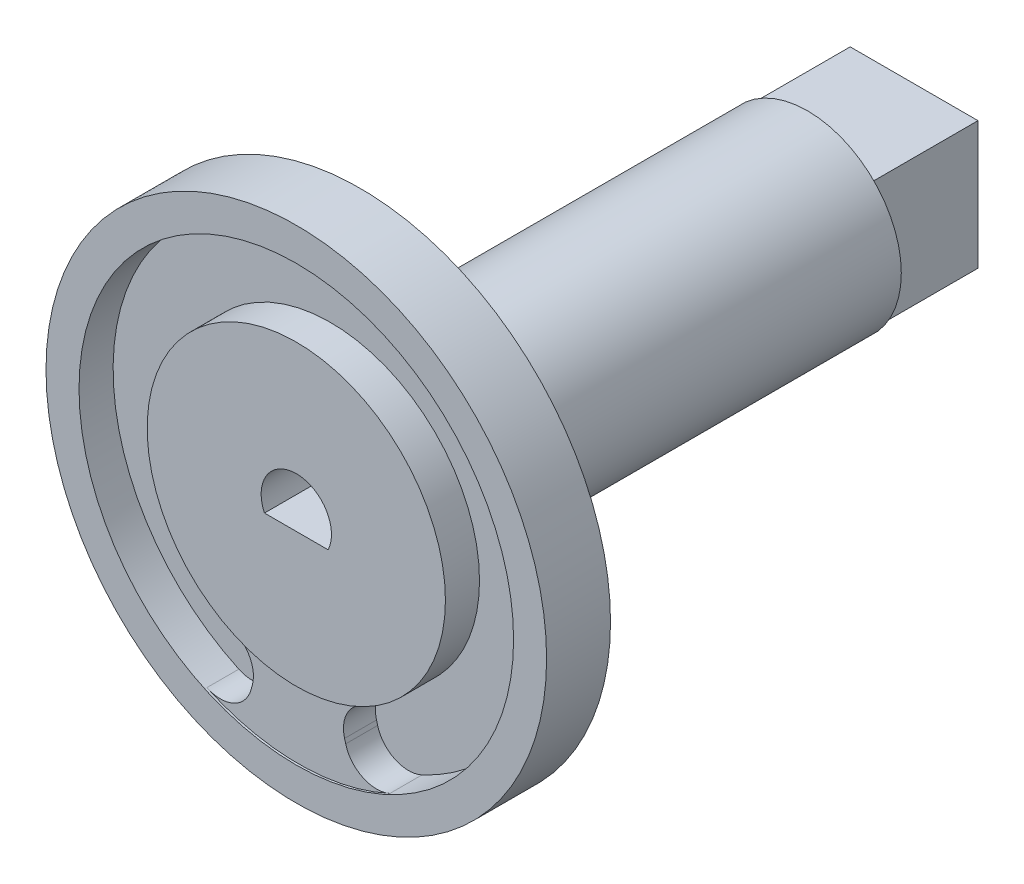
ISO-10303-21;
HEADER;
FILE_DESCRIPTION(('STEP AP214'),'2;1');
FILE_NAME('part.step','',(''),(''),'','','');
FILE_SCHEMA(('AUTOMOTIVE_DESIGN { 1 0 10303 214 1 1 1 1 }'));
ENDSEC;
DATA;
#1=APPLICATION_CONTEXT('core data for automotive mechanical design processes');
#2=APPLICATION_PROTOCOL_DEFINITION('international standard','automotive_design',2000,#1);
#3=PRODUCT_CONTEXT('',#1,'mechanical');
#4=PRODUCT('Part','Part','',(#3));
#5=PRODUCT_RELATED_PRODUCT_CATEGORY('part','',(#4));
#6=PRODUCT_DEFINITION_FORMATION('','',#4);
#7=PRODUCT_DEFINITION_CONTEXT('part definition',#1,'design');
#8=PRODUCT_DEFINITION('design','',#6,#7);
#9=PRODUCT_DEFINITION_SHAPE('','',#8);
#10=(LENGTH_UNIT() NAMED_UNIT(*) SI_UNIT(.MILLI.,.METRE.));
#11=(NAMED_UNIT(*) PLANE_ANGLE_UNIT() SI_UNIT($,.RADIAN.));
#12=(NAMED_UNIT(*) SI_UNIT($,.STERADIAN.) SOLID_ANGLE_UNIT());
#13=UNCERTAINTY_MEASURE_WITH_UNIT(LENGTH_MEASURE(1.E-05),#10,'distance_accuracy_value','');
#14=(GEOMETRIC_REPRESENTATION_CONTEXT(3) GLOBAL_UNCERTAINTY_ASSIGNED_CONTEXT((#13)) GLOBAL_UNIT_ASSIGNED_CONTEXT((#10,
#11,#12)) REPRESENTATION_CONTEXT('',''));
#15=CARTESIAN_POINT('',(0.,0.,0.));
#16=DIRECTION('',(0.,0.,1.));
#17=DIRECTION('',(1.,0.,0.));
#18=AXIS2_PLACEMENT_3D('',#15,#16,#17);
#19=CARTESIAN_POINT('',(0.,0.,0.));
#20=DIRECTION('',(0.,0.,1.));
#21=DIRECTION('',(1.,0.,0.));
#22=AXIS2_PLACEMENT_3D('',#19,#20,#21);
#23=PLANE('',#22);
#24=CARTESIAN_POINT('',(0.,0.,0.));
#25=DIRECTION('',(0.,0.,1.));
#26=DIRECTION('',(1.,0.,0.));
#27=AXIS2_PLACEMENT_3D('',#24,#25,#26);
#28=CIRCLE('',#27,11.75);
#29=CARTESIAN_POINT('',(11.75,0.,0.));
#30=VERTEX_POINT('',#29);
#31=EDGE_CURVE('E247',#30,#30,#28,.T.);
#32=ORIENTED_EDGE('',*,*,#31,.F.);
#33=EDGE_LOOP('',(#32));
#34=FACE_BOUND('',#33,.T.);
#35=CARTESIAN_POINT('',(0.,0.,0.));
#36=DIRECTION('',(0.,0.,1.));
#37=DIRECTION('',(1.,0.,0.));
#38=AXIS2_PLACEMENT_3D('',#35,#36,#37);
#39=CIRCLE('',#38,4.4);
#40=CARTESIAN_POINT('',(4.4,0.,0.));
#41=VERTEX_POINT('',#40);
#42=EDGE_CURVE('E11',#41,#41,#39,.F.);
#43=ORIENTED_EDGE('',*,*,#42,.F.);
#44=EDGE_LOOP('',(#43));
#45=FACE_BOUND('',#44,.T.);
#46=ADVANCED_FACE('F36',(#34,#45),#23,.F.);
#47=CARTESIAN_POINT('',(0.,0.,1.4));
#48=DIRECTION('',(0.,0.,1.));
#49=DIRECTION('',(1.,0.,0.));
#50=AXIS2_PLACEMENT_3D('',#47,#48,#49);
#51=CYLINDRICAL_SURFACE('',#50,10.2);
#52=CARTESIAN_POINT('',(0.,0.,3.));
#53=DIRECTION('',(0.,0.,1.));
#54=DIRECTION('',(1.,0.,0.));
#55=AXIS2_PLACEMENT_3D('',#52,#53,#54);
#56=CIRCLE('',#55,10.2);
#57=CARTESIAN_POINT('',(10.2,0.,3.));
#58=VERTEX_POINT('',#57);
#59=EDGE_CURVE('E241',#58,#58,#56,.T.);
#60=ORIENTED_EDGE('',*,*,#59,.T.);
#61=EDGE_LOOP('',(#60));
#62=FACE_BOUND('',#61,.T.);
#63=CARTESIAN_POINT('',(0.,0.,2.9));
#64=DIRECTION('',(0.,0.,1.));
#65=DIRECTION('',(1.,0.,0.));
#66=AXIS2_PLACEMENT_3D('',#63,#64,#65);
#67=CIRCLE('',#66,10.2);
#68=CARTESIAN_POINT('',(-4.29911706040399,-9.24973472597692,2.9));
#69=VERTEX_POINT('',#68);
#70=CARTESIAN_POINT('',(4.29911706040399,-9.24973472597692,2.9));
#71=VERTEX_POINT('',#70);
#72=EDGE_CURVE('E228',#69,#71,#67,.T.);
#73=ORIENTED_EDGE('',*,*,#72,.F.);
#74=DIRECTION('',(0.,0.,1.));
#75=VECTOR('',#74,1.);
#76=CARTESIAN_POINT('',(-4.29911706040399,-9.24973472597692,1.4));
#77=LINE('',#76,#75);
#78=CARTESIAN_POINT('',(-4.29911706040399,-9.24973472597692,1.4));
#79=VERTEX_POINT('',#78);
#80=EDGE_CURVE('E258',#69,#79,#77,.F.);
#81=ORIENTED_EDGE('',*,*,#80,.T.);
#82=CARTESIAN_POINT('',(0.,0.,1.4));
#83=DIRECTION('',(0.,0.,1.));
#84=DIRECTION('',(1.,0.,0.));
#85=AXIS2_PLACEMENT_3D('',#82,#83,#84);
#86=CIRCLE('',#85,10.2);
#87=CARTESIAN_POINT('',(4.29911706040399,-9.24973472597692,1.4));
#88=VERTEX_POINT('',#87);
#89=EDGE_CURVE('E244',#88,#79,#86,.T.);
#90=ORIENTED_EDGE('',*,*,#89,.F.);
#91=DIRECTION('',(0.,0.,1.));
#92=VECTOR('',#91,1.);
#93=CARTESIAN_POINT('',(4.29911706040399,-9.24973472597692,1.4));
#94=LINE('',#93,#92);
#95=EDGE_CURVE('E253',#88,#71,#94,.T.);
#96=ORIENTED_EDGE('',*,*,#95,.T.);
#97=EDGE_LOOP('',(#73,#81,#90,#96));
#98=FACE_BOUND('',#97,.T.);
#99=ADVANCED_FACE('F321',(#62,#98),#51,.F.);
#100=CARTESIAN_POINT('',(0.,0.,1.4));
#101=DIRECTION('',(0.,0.,1.));
#102=DIRECTION('',(1.,0.,0.));
#103=AXIS2_PLACEMENT_3D('',#100,#101,#102);
#104=PLANE('',#103);
#105=ORIENTED_EDGE('',*,*,#89,.T.);
#106=CARTESIAN_POINT('',(-3.66689396328576,-7.88947961921561,1.4));
#107=DIRECTION('',(0.,0.,1.));
#108=DIRECTION('',(1.,0.,0.));
#109=AXIS2_PLACEMENT_3D('',#106,#107,#108);
#110=CIRCLE('',#109,1.5);
#111=CARTESIAN_POINT('',(-2.21800522385215,-8.27770818686939,1.4));
#112=VERTEX_POINT('',#111);
#113=EDGE_CURVE('E267',#79,#112,#110,.T.);
#114=ORIENTED_EDGE('',*,*,#113,.T.);
#115=DIRECTION('',(-0.258819045102522,-0.965925826289068,0.));
#116=VECTOR('',#115,1.);
#117=CARTESIAN_POINT('',(-1.81173331571765,-6.76148078402348,1.4));
#118=LINE('',#117,#116);
#119=CARTESIAN_POINT('',(-2.16543549143,-8.08151527452961,1.4));
#120=VERTEX_POINT('',#119);
#121=EDGE_CURVE('E221',#120,#112,#118,.T.);
#122=ORIENTED_EDGE('',*,*,#121,.F.);
#123=CARTESIAN_POINT('',(-3.6143242308636,-7.69328670687582,1.4));
#124=DIRECTION('',(0.,0.,1.));
#125=DIRECTION('',(1.,0.,0.));
#126=AXIS2_PLACEMENT_3D('',#123,#124,#125);
#127=CIRCLE('',#126,1.5);
#128=CARTESIAN_POINT('',(-2.97650230777002,-6.33564787625068,1.4));
#129=VERTEX_POINT('',#128);
#130=EDGE_CURVE('E265',#120,#129,#127,.T.);
#131=ORIENTED_EDGE('',*,*,#130,.T.);
#132=CARTESIAN_POINT('',(0.,0.,1.4));
#133=DIRECTION('',(0.,0.,1.));
#134=DIRECTION('',(1.,0.,0.));
#135=AXIS2_PLACEMENT_3D('',#132,#133,#134);
#136=CIRCLE('',#135,7.);
#137=CARTESIAN_POINT('',(2.97650230777002,-6.33564787625068,1.4));
#138=VERTEX_POINT('',#137);
#139=EDGE_CURVE('E238',#138,#129,#136,.T.);
#140=ORIENTED_EDGE('',*,*,#139,.F.);
#141=CARTESIAN_POINT('',(3.6143242308636,-7.69328670687582,1.4));
#142=DIRECTION('',(0.,0.,1.));
#143=DIRECTION('',(1.,0.,0.));
#144=AXIS2_PLACEMENT_3D('',#141,#142,#143);
#145=CIRCLE('',#144,1.5);
#146=CARTESIAN_POINT('',(2.16543549143,-8.08151527452961,1.4));
#147=VERTEX_POINT('',#146);
#148=EDGE_CURVE('E261',#138,#147,#145,.T.);
#149=ORIENTED_EDGE('',*,*,#148,.T.);
#150=DIRECTION('',(-0.258819045102522,0.965925826289068,0.));
#151=VECTOR('',#150,1.);
#152=CARTESIAN_POINT('',(1.81173331571765,-6.76148078402348,1.4));
#153=LINE('',#152,#151);
#154=CARTESIAN_POINT('',(2.21800522385215,-8.27770818686939,1.4));
#155=VERTEX_POINT('',#154);
#156=EDGE_CURVE('E225',#155,#147,#153,.T.);
#157=ORIENTED_EDGE('',*,*,#156,.F.);
#158=CARTESIAN_POINT('',(3.66689396328576,-7.88947961921561,1.4));
#159=DIRECTION('',(0.,0.,1.));
#160=DIRECTION('',(1.,0.,0.));
#161=AXIS2_PLACEMENT_3D('',#158,#159,#160);
#162=CIRCLE('',#161,1.5);
#163=EDGE_CURVE('E263',#155,#88,#162,.T.);
#164=ORIENTED_EDGE('',*,*,#163,.T.);
#165=EDGE_LOOP('',(#105,#114,#122,#131,#140,#149,#157,#164));
#166=FACE_BOUND('',#165,.T.);
#167=ADVANCED_FACE('F304',(#166),#104,.T.);
#168=CARTESIAN_POINT('',(0.,0.,1.4));
#169=DIRECTION('',(0.,0.,1.));
#170=DIRECTION('',(1.,0.,0.));
#171=AXIS2_PLACEMENT_3D('',#168,#169,#170);
#172=CYLINDRICAL_SURFACE('',#171,7.);
#173=CARTESIAN_POINT('',(0.,0.,3.));
#174=DIRECTION('',(0.,0.,1.));
#175=DIRECTION('',(1.,0.,0.));
#176=AXIS2_PLACEMENT_3D('',#173,#174,#175);
#177=CIRCLE('',#176,7.);
#178=CARTESIAN_POINT('',(7.,0.,3.));
#179=VERTEX_POINT('',#178);
#180=EDGE_CURVE('E233',#179,#179,#177,.T.);
#181=ORIENTED_EDGE('',*,*,#180,.F.);
#182=EDGE_LOOP('',(#181));
#183=FACE_BOUND('',#182,.T.);
#184=ORIENTED_EDGE('',*,*,#139,.T.);
#185=DIRECTION('',(0.,0.,1.));
#186=VECTOR('',#185,1.);
#187=CARTESIAN_POINT('',(-2.97650230777002,-6.33564787625068,1.4));
#188=LINE('',#187,#186);
#189=CARTESIAN_POINT('',(-2.97650230777002,-6.33564787625068,2.9));
#190=VERTEX_POINT('',#189);
#191=EDGE_CURVE('E277',#129,#190,#188,.T.);
#192=ORIENTED_EDGE('',*,*,#191,.T.);
#193=CARTESIAN_POINT('',(0.,0.,2.9));
#194=DIRECTION('',(0.,0.,-1.));
#195=DIRECTION('',(1.,0.,0.));
#196=AXIS2_PLACEMENT_3D('',#193,#194,#195);
#197=CIRCLE('',#196,7.);
#198=CARTESIAN_POINT('',(2.97650230777002,-6.33564787625068,2.9));
#199=VERTEX_POINT('',#198);
#200=EDGE_CURVE('E222',#199,#190,#197,.T.);
#201=ORIENTED_EDGE('',*,*,#200,.F.);
#202=DIRECTION('',(0.,0.,1.));
#203=VECTOR('',#202,1.);
#204=CARTESIAN_POINT('',(2.97650230777002,-6.33564787625068,1.4));
#205=LINE('',#204,#203);
#206=EDGE_CURVE('E274',#199,#138,#205,.F.);
#207=ORIENTED_EDGE('',*,*,#206,.T.);
#208=EDGE_LOOP('',(#184,#192,#201,#207));
#209=FACE_BOUND('',#208,.T.);
#210=ADVANCED_FACE('F301',(#183,#209),#172,.T.);
#211=CARTESIAN_POINT('',(0.,0.,3.));
#212=DIRECTION('',(0.,0.,1.));
#213=DIRECTION('',(1.,0.,0.));
#214=AXIS2_PLACEMENT_3D('',#211,#212,#213);
#215=PLANE('',#214);
#216=CARTESIAN_POINT('',(0.,0.,3.));
#217=DIRECTION('',(0.,0.,1.));
#218=DIRECTION('',(1.,0.,0.));
#219=AXIS2_PLACEMENT_3D('',#216,#217,#218);
#220=CIRCLE('',#219,1.65);
#221=CARTESIAN_POINT('',(1.49415527974839,-0.7,3.));
#222=VERTEX_POINT('',#221);
#223=CARTESIAN_POINT('',(-1.49415527974839,-0.7,3.));
#224=VERTEX_POINT('',#223);
#225=EDGE_CURVE('E51',#222,#224,#220,.T.);
#226=ORIENTED_EDGE('',*,*,#225,.F.);
#227=DIRECTION('',(1.,0.,0.));
#228=VECTOR('',#227,1.);
#229=CARTESIAN_POINT('',(1.49415527974839,-0.7,3.));
#230=LINE('',#229,#228);
#231=EDGE_CURVE('E175',#224,#222,#230,.T.);
#232=ORIENTED_EDGE('',*,*,#231,.F.);
#233=EDGE_LOOP('',(#226,#232));
#234=FACE_BOUND('',#233,.T.);
#235=ORIENTED_EDGE('',*,*,#180,.T.);
#236=EDGE_LOOP('',(#235));
#237=FACE_BOUND('',#236,.T.);
#238=ADVANCED_FACE('F353',(#234,#237),#215,.T.);
#239=CARTESIAN_POINT('',(0.,0.,3.));
#240=DIRECTION('',(0.,0.,-1.));
#241=DIRECTION('',(-1.,0.,0.));
#242=AXIS2_PLACEMENT_3D('',#239,#240,#241);
#243=CYLINDRICAL_SURFACE('',#242,11.75);
#244=CARTESIAN_POINT('',(0.,0.,3.));
#245=DIRECTION('',(0.,0.,1.));
#246=DIRECTION('',(1.,0.,0.));
#247=AXIS2_PLACEMENT_3D('',#244,#245,#246);
#248=CIRCLE('',#247,11.75);
#249=CARTESIAN_POINT('',(11.75,0.,3.));
#250=VERTEX_POINT('',#249);
#251=EDGE_CURVE('E250',#250,#250,#248,.T.);
#252=ORIENTED_EDGE('',*,*,#251,.F.);
#253=EDGE_LOOP('',(#252));
#254=FACE_BOUND('',#253,.T.);
#255=ORIENTED_EDGE('',*,*,#31,.T.);
#256=EDGE_LOOP('',(#255));
#257=FACE_BOUND('',#256,.T.);
#258=ADVANCED_FACE('F350',(#254,#257),#243,.T.);
#259=ORIENTED_EDGE('',*,*,#59,.F.);
#260=EDGE_LOOP('',(#259));
#261=FACE_BOUND('',#260,.T.);
#262=ORIENTED_EDGE('',*,*,#251,.T.);
#263=EDGE_LOOP('',(#262));
#264=FACE_BOUND('',#263,.T.);
#265=ADVANCED_FACE('F336',(#261,#264),#215,.T.);
#266=CARTESIAN_POINT('',(-1.81173331571765,-6.76148078402348,2.9));
#267=DIRECTION('',(0.965925826289068,-0.258819045102522,0.));
#268=DIRECTION('',(0.258819045102522,0.965925826289068,0.));
#269=AXIS2_PLACEMENT_3D('',#266,#267,#268);
#270=PLANE('',#269);
#271=ORIENTED_EDGE('',*,*,#121,.T.);
#272=DIRECTION('',(0.,0.,-1.));
#273=VECTOR('',#272,1.);
#274=CARTESIAN_POINT('',(-2.21800522385215,-8.27770818686939,2.9));
#275=LINE('',#274,#273);
#276=CARTESIAN_POINT('',(-2.21800522385215,-8.27770818686939,2.9));
#277=VERTEX_POINT('',#276);
#278=EDGE_CURVE('E272',#112,#277,#275,.F.);
#279=ORIENTED_EDGE('',*,*,#278,.T.);
#280=DIRECTION('',(-0.258819045102522,-0.965925826289068,0.));
#281=VECTOR('',#280,1.);
#282=CARTESIAN_POINT('',(-1.81173331571765,-6.76148078402348,2.9));
#283=LINE('',#282,#281);
#284=CARTESIAN_POINT('',(-2.16543549143,-8.08151527452961,2.9));
#285=VERTEX_POINT('',#284);
#286=EDGE_CURVE('E224',#285,#277,#283,.T.);
#287=ORIENTED_EDGE('',*,*,#286,.F.);
#288=DIRECTION('',(0.,0.,1.));
#289=VECTOR('',#288,1.);
#290=CARTESIAN_POINT('',(-2.16543549143,-8.08151527452961,2.9));
#291=LINE('',#290,#289);
#292=EDGE_CURVE('E269',#285,#120,#291,.F.);
#293=ORIENTED_EDGE('',*,*,#292,.T.);
#294=EDGE_LOOP('',(#271,#279,#287,#293));
#295=FACE_BOUND('',#294,.T.);
#296=ADVANCED_FACE('F313',(#295),#270,.F.);
#297=CARTESIAN_POINT('',(1.81173331571765,-6.76148078402348,2.9));
#298=DIRECTION('',(-0.965925826289068,-0.258819045102522,0.));
#299=DIRECTION('',(0.258819045102522,-0.965925826289068,0.));
#300=AXIS2_PLACEMENT_3D('',#297,#298,#299);
#301=PLANE('',#300);
#302=DIRECTION('',(-0.258819045102522,0.965925826289068,0.));
#303=VECTOR('',#302,1.);
#304=CARTESIAN_POINT('',(1.81173331571765,-6.76148078402348,2.9));
#305=LINE('',#304,#303);
#306=CARTESIAN_POINT('',(2.21800522385215,-8.27770818686939,2.9));
#307=VERTEX_POINT('',#306);
#308=CARTESIAN_POINT('',(2.16543549143,-8.08151527452961,2.9));
#309=VERTEX_POINT('',#308);
#310=EDGE_CURVE('E230',#307,#309,#305,.T.);
#311=ORIENTED_EDGE('',*,*,#310,.F.);
#312=DIRECTION('',(0.,0.,-1.));
#313=VECTOR('',#312,1.);
#314=CARTESIAN_POINT('',(2.21800522385215,-8.27770818686939,1.4));
#315=LINE('',#314,#313);
#316=EDGE_CURVE('E282',#307,#155,#315,.T.);
#317=ORIENTED_EDGE('',*,*,#316,.T.);
#318=ORIENTED_EDGE('',*,*,#156,.T.);
#319=DIRECTION('',(0.,0.,1.));
#320=VECTOR('',#319,1.);
#321=CARTESIAN_POINT('',(2.16543549143,-8.08151527452961,2.9));
#322=LINE('',#321,#320);
#323=EDGE_CURVE('E280',#147,#309,#322,.T.);
#324=ORIENTED_EDGE('',*,*,#323,.T.);
#325=EDGE_LOOP('',(#311,#317,#318,#324));
#326=FACE_BOUND('',#325,.T.);
#327=ADVANCED_FACE('F328',(#326),#301,.F.);
#328=CARTESIAN_POINT('',(0.,0.,2.9));
#329=DIRECTION('',(0.,0.,1.));
#330=DIRECTION('',(1.,0.,0.));
#331=AXIS2_PLACEMENT_3D('',#328,#329,#330);
#332=PLANE('',#331);
#333=ORIENTED_EDGE('',*,*,#200,.T.);
#334=CARTESIAN_POINT('',(-3.6143242308636,-7.69328670687582,2.9));
#335=DIRECTION('',(0.,0.,1.));
#336=DIRECTION('',(1.,0.,0.));
#337=AXIS2_PLACEMENT_3D('',#334,#335,#336);
#338=CIRCLE('',#337,1.5);
#339=EDGE_CURVE('E288',#190,#285,#338,.F.);
#340=ORIENTED_EDGE('',*,*,#339,.T.);
#341=ORIENTED_EDGE('',*,*,#286,.T.);
#342=CARTESIAN_POINT('',(-3.66689396328576,-7.88947961921561,2.9));
#343=DIRECTION('',(0.,0.,1.));
#344=DIRECTION('',(1.,0.,0.));
#345=AXIS2_PLACEMENT_3D('',#342,#343,#344);
#346=CIRCLE('',#345,1.5);
#347=EDGE_CURVE('E285',#277,#69,#346,.F.);
#348=ORIENTED_EDGE('',*,*,#347,.T.);
#349=ORIENTED_EDGE('',*,*,#72,.T.);
#350=CARTESIAN_POINT('',(3.66689396328576,-7.88947961921561,2.9));
#351=DIRECTION('',(0.,0.,1.));
#352=DIRECTION('',(1.,0.,0.));
#353=AXIS2_PLACEMENT_3D('',#350,#351,#352);
#354=CIRCLE('',#353,1.5);
#355=EDGE_CURVE('E290',#71,#307,#354,.F.);
#356=ORIENTED_EDGE('',*,*,#355,.T.);
#357=ORIENTED_EDGE('',*,*,#310,.T.);
#358=CARTESIAN_POINT('',(3.6143242308636,-7.69328670687582,2.9));
#359=DIRECTION('',(0.,0.,1.));
#360=DIRECTION('',(1.,0.,0.));
#361=AXIS2_PLACEMENT_3D('',#358,#359,#360);
#362=CIRCLE('',#361,1.5);
#363=EDGE_CURVE('E44',#309,#199,#362,.F.);
#364=ORIENTED_EDGE('',*,*,#363,.T.);
#365=EDGE_LOOP('',(#333,#340,#341,#348,#349,#356,#357,#364));
#366=FACE_BOUND('',#365,.T.);
#367=ADVANCED_FACE('F295',(#366),#332,.T.);
#368=CARTESIAN_POINT('',(-3.66689396328576,-7.88947961921561,1.4));
#369=DIRECTION('',(0.,0.,1.));
#370=DIRECTION('',(1.,0.,0.));
#371=AXIS2_PLACEMENT_3D('',#368,#369,#370);
#372=CYLINDRICAL_SURFACE('',#371,1.5);
#373=ORIENTED_EDGE('',*,*,#347,.F.);
#374=ORIENTED_EDGE('',*,*,#278,.F.);
#375=ORIENTED_EDGE('',*,*,#113,.F.);
#376=ORIENTED_EDGE('',*,*,#80,.F.);
#377=EDGE_LOOP('',(#373,#374,#375,#376));
#378=FACE_BOUND('',#377,.T.);
#379=ADVANCED_FACE('F318',(#378),#372,.F.);
#380=CARTESIAN_POINT('',(-3.6143242308636,-7.69328670687582,1.4));
#381=DIRECTION('',(0.,0.,1.));
#382=DIRECTION('',(1.,0.,0.));
#383=AXIS2_PLACEMENT_3D('',#380,#381,#382);
#384=CYLINDRICAL_SURFACE('',#383,1.5);
#385=ORIENTED_EDGE('',*,*,#339,.F.);
#386=ORIENTED_EDGE('',*,*,#191,.F.);
#387=ORIENTED_EDGE('',*,*,#130,.F.);
#388=ORIENTED_EDGE('',*,*,#292,.F.);
#389=EDGE_LOOP('',(#385,#386,#387,#388));
#390=FACE_BOUND('',#389,.T.);
#391=ADVANCED_FACE('F310',(#390),#384,.F.);
#392=CARTESIAN_POINT('',(3.66689396328576,-7.88947961921561,1.4));
#393=DIRECTION('',(0.,0.,1.));
#394=DIRECTION('',(1.,0.,0.));
#395=AXIS2_PLACEMENT_3D('',#392,#393,#394);
#396=CYLINDRICAL_SURFACE('',#395,1.5);
#397=ORIENTED_EDGE('',*,*,#355,.F.);
#398=ORIENTED_EDGE('',*,*,#95,.F.);
#399=ORIENTED_EDGE('',*,*,#163,.F.);
#400=ORIENTED_EDGE('',*,*,#316,.F.);
#401=EDGE_LOOP('',(#397,#398,#399,#400));
#402=FACE_BOUND('',#401,.T.);
#403=ADVANCED_FACE('F326',(#402),#396,.F.);
#404=CARTESIAN_POINT('',(3.6143242308636,-7.69328670687582,1.4));
#405=DIRECTION('',(0.,0.,1.));
#406=DIRECTION('',(1.,0.,0.));
#407=AXIS2_PLACEMENT_3D('',#404,#405,#406);
#408=CYLINDRICAL_SURFACE('',#407,1.5);
#409=ORIENTED_EDGE('',*,*,#363,.F.);
#410=ORIENTED_EDGE('',*,*,#323,.F.);
#411=ORIENTED_EDGE('',*,*,#148,.F.);
#412=ORIENTED_EDGE('',*,*,#206,.F.);
#413=EDGE_LOOP('',(#409,#410,#411,#412));
#414=FACE_BOUND('',#413,.T.);
#415=ADVANCED_FACE('F38',(#414),#408,.F.);
#416=CARTESIAN_POINT('',(0.,0.,-2.));
#417=DIRECTION('',(0.,0.,1.));
#418=DIRECTION('',(1.,0.,0.));
#419=AXIS2_PLACEMENT_3D('',#416,#417,#418);
#420=CYLINDRICAL_SURFACE('',#419,4.4);
#421=ORIENTED_EDGE('',*,*,#42,.T.);
#422=EDGE_LOOP('',(#421));
#423=FACE_BOUND('',#422,.T.);
#424=CARTESIAN_POINT('',(0.,0.,-21.));
#425=DIRECTION('',(0.,0.,-1.));
#426=DIRECTION('',(-1.,0.,0.));
#427=AXIS2_PLACEMENT_3D('',#424,#425,#426);
#428=CIRCLE('',#427,4.4);
#429=CARTESIAN_POINT('',(-4.4,0.,-21.));
#430=VERTEX_POINT('',#429);
#431=EDGE_CURVE('E215',#430,#430,#428,.T.);
#432=ORIENTED_EDGE('',*,*,#431,.F.);
#433=EDGE_LOOP('',(#432));
#434=FACE_BOUND('',#433,.T.);
#435=ADVANCED_FACE('F362',(#423,#434),#420,.T.);
#436=CARTESIAN_POINT('',(0.,0.,-21.));
#437=DIRECTION('',(0.,0.,-1.));
#438=DIRECTION('',(-1.,0.,0.));
#439=AXIS2_PLACEMENT_3D('',#436,#437,#438);
#440=PLANE('',#439);
#441=DIRECTION('',(0.,1.,0.));
#442=VECTOR('',#441,1.);
#443=CARTESIAN_POINT('',(-3.,-3.,-21.));
#444=LINE('',#443,#442);
#445=CARTESIAN_POINT('',(-3.,-3.,-21.));
#446=VERTEX_POINT('',#445);
#447=CARTESIAN_POINT('',(-3.,3.,-21.));
#448=VERTEX_POINT('',#447);
#449=EDGE_CURVE('E59',#446,#448,#444,.T.);
#450=ORIENTED_EDGE('',*,*,#449,.F.);
#451=DIRECTION('',(-1.,0.,0.));
#452=VECTOR('',#451,1.);
#453=CARTESIAN_POINT('',(3.,-3.,-21.));
#454=LINE('',#453,#452);
#455=CARTESIAN_POINT('',(3.,-3.,-21.));
#456=VERTEX_POINT('',#455);
#457=EDGE_CURVE('E189',#456,#446,#454,.T.);
#458=ORIENTED_EDGE('',*,*,#457,.F.);
#459=DIRECTION('',(0.,-1.,0.));
#460=VECTOR('',#459,1.);
#461=CARTESIAN_POINT('',(3.,-3.,-21.));
#462=LINE('',#461,#460);
#463=CARTESIAN_POINT('',(3.,3.,-21.));
#464=VERTEX_POINT('',#463);
#465=EDGE_CURVE('E200',#464,#456,#462,.T.);
#466=ORIENTED_EDGE('',*,*,#465,.F.);
#467=DIRECTION('',(1.,0.,0.));
#468=VECTOR('',#467,1.);
#469=CARTESIAN_POINT('',(3.,3.,-21.));
#470=LINE('',#469,#468);
#471=EDGE_CURVE('E197',#448,#464,#470,.T.);
#472=ORIENTED_EDGE('',*,*,#471,.F.);
#473=EDGE_LOOP('',(#450,#458,#466,#472));
#474=FACE_BOUND('',#473,.T.);
#475=ORIENTED_EDGE('',*,*,#431,.T.);
#476=EDGE_LOOP('',(#475));
#477=FACE_BOUND('',#476,.T.);
#478=ADVANCED_FACE('F366',(#474,#477),#440,.T.);
#479=CARTESIAN_POINT('',(-3.,-3.,-26.));
#480=DIRECTION('',(1.,0.,0.));
#481=DIRECTION('',(0.,0.,-1.));
#482=AXIS2_PLACEMENT_3D('',#479,#480,#481);
#483=PLANE('',#482);
#484=ORIENTED_EDGE('',*,*,#449,.T.);
#485=DIRECTION('',(0.,0.,1.));
#486=VECTOR('',#485,1.);
#487=CARTESIAN_POINT('',(-3.,3.,-26.));
#488=LINE('',#487,#486);
#489=CARTESIAN_POINT('',(-3.,3.,-26.));
#490=VERTEX_POINT('',#489);
#491=EDGE_CURVE('E212',#490,#448,#488,.T.);
#492=ORIENTED_EDGE('',*,*,#491,.F.);
#493=DIRECTION('',(0.,1.,0.));
#494=VECTOR('',#493,1.);
#495=CARTESIAN_POINT('',(-3.,-3.,-26.));
#496=LINE('',#495,#494);
#497=CARTESIAN_POINT('',(-3.,-3.,-26.));
#498=VERTEX_POINT('',#497);
#499=EDGE_CURVE('E185',#498,#490,#496,.T.);
#500=ORIENTED_EDGE('',*,*,#499,.F.);
#501=DIRECTION('',(0.,0.,1.));
#502=VECTOR('',#501,1.);
#503=CARTESIAN_POINT('',(-3.,-3.,-26.));
#504=LINE('',#503,#502);
#505=EDGE_CURVE('E195',#498,#446,#504,.T.);
#506=ORIENTED_EDGE('',*,*,#505,.T.);
#507=EDGE_LOOP('',(#484,#492,#500,#506));
#508=FACE_BOUND('',#507,.T.);
#509=ADVANCED_FACE('F372',(#508),#483,.F.);
#510=CARTESIAN_POINT('',(3.,3.,-26.));
#511=DIRECTION('',(0.,-1.,0.));
#512=DIRECTION('',(0.,0.,-1.));
#513=AXIS2_PLACEMENT_3D('',#510,#511,#512);
#514=PLANE('',#513);
#515=ORIENTED_EDGE('',*,*,#471,.T.);
#516=DIRECTION('',(0.,0.,1.));
#517=VECTOR('',#516,1.);
#518=CARTESIAN_POINT('',(3.,3.,-26.));
#519=LINE('',#518,#517);
#520=CARTESIAN_POINT('',(3.,3.,-26.));
#521=VERTEX_POINT('',#520);
#522=EDGE_CURVE('E209',#521,#464,#519,.T.);
#523=ORIENTED_EDGE('',*,*,#522,.F.);
#524=DIRECTION('',(1.,0.,0.));
#525=VECTOR('',#524,1.);
#526=CARTESIAN_POINT('',(3.,3.,-26.));
#527=LINE('',#526,#525);
#528=EDGE_CURVE('E188',#490,#521,#527,.T.);
#529=ORIENTED_EDGE('',*,*,#528,.F.);
#530=ORIENTED_EDGE('',*,*,#491,.T.);
#531=EDGE_LOOP('',(#515,#523,#529,#530));
#532=FACE_BOUND('',#531,.T.);
#533=ADVANCED_FACE('F382',(#532),#514,.F.);
#534=CARTESIAN_POINT('',(3.,-3.,-26.));
#535=DIRECTION('',(-1.,0.,0.));
#536=DIRECTION('',(0.,0.,1.));
#537=AXIS2_PLACEMENT_3D('',#534,#535,#536);
#538=PLANE('',#537);
#539=ORIENTED_EDGE('',*,*,#465,.T.);
#540=DIRECTION('',(0.,0.,1.));
#541=VECTOR('',#540,1.);
#542=CARTESIAN_POINT('',(3.,-3.,-26.));
#543=LINE('',#542,#541);
#544=CARTESIAN_POINT('',(3.,-3.,-26.));
#545=VERTEX_POINT('',#544);
#546=EDGE_CURVE('E206',#545,#456,#543,.T.);
#547=ORIENTED_EDGE('',*,*,#546,.F.);
#548=DIRECTION('',(0.,-1.,0.));
#549=VECTOR('',#548,1.);
#550=CARTESIAN_POINT('',(3.,-3.,-26.));
#551=LINE('',#550,#549);
#552=EDGE_CURVE('E191',#521,#545,#551,.T.);
#553=ORIENTED_EDGE('',*,*,#552,.F.);
#554=ORIENTED_EDGE('',*,*,#522,.T.);
#555=EDGE_LOOP('',(#539,#547,#553,#554));
#556=FACE_BOUND('',#555,.T.);
#557=ADVANCED_FACE('F386',(#556),#538,.F.);
#558=CARTESIAN_POINT('',(3.,-3.,-26.));
#559=DIRECTION('',(0.,1.,0.));
#560=DIRECTION('',(0.,0.,1.));
#561=AXIS2_PLACEMENT_3D('',#558,#559,#560);
#562=PLANE('',#561);
#563=ORIENTED_EDGE('',*,*,#457,.T.);
#564=ORIENTED_EDGE('',*,*,#505,.F.);
#565=DIRECTION('',(-1.,0.,0.));
#566=VECTOR('',#565,1.);
#567=CARTESIAN_POINT('',(3.,-3.,-26.));
#568=LINE('',#567,#566);
#569=EDGE_CURVE('E193',#545,#498,#568,.T.);
#570=ORIENTED_EDGE('',*,*,#569,.F.);
#571=ORIENTED_EDGE('',*,*,#546,.T.);
#572=EDGE_LOOP('',(#563,#564,#570,#571));
#573=FACE_BOUND('',#572,.T.);
#574=ADVANCED_FACE('F390',(#573),#562,.F.);
#575=CARTESIAN_POINT('',(0.,0.,-26.));
#576=DIRECTION('',(0.,0.,1.));
#577=DIRECTION('',(1.,0.,0.));
#578=AXIS2_PLACEMENT_3D('',#575,#576,#577);
#579=PLANE('',#578);
#580=ORIENTED_EDGE('',*,*,#499,.T.);
#581=ORIENTED_EDGE('',*,*,#528,.T.);
#582=ORIENTED_EDGE('',*,*,#552,.T.);
#583=ORIENTED_EDGE('',*,*,#569,.T.);
#584=EDGE_LOOP('',(#580,#581,#582,#583));
#585=FACE_BOUND('',#584,.T.);
#586=ADVANCED_FACE('F394',(#585),#579,.F.);
#587=CARTESIAN_POINT('',(0.,0.,-7.));
#588=DIRECTION('',(0.,0.,1.));
#589=DIRECTION('',(1.,0.,0.));
#590=AXIS2_PLACEMENT_3D('',#587,#588,#589);
#591=CYLINDRICAL_SURFACE('',#590,1.55);
#592=CARTESIAN_POINT('',(0.,0.,-2.));
#593=DIRECTION('',(0.,0.,-1.));
#594=DIRECTION('',(-1.,0.,0.));
#595=AXIS2_PLACEMENT_3D('',#592,#593,#594);
#596=CIRCLE('',#595,1.55);
#597=CARTESIAN_POINT('',(-1.42916059279565,-0.6,-2.));
#598=VERTEX_POINT('',#597);
#599=CARTESIAN_POINT('',(1.42916059279565,-0.6,-2.));
#600=VERTEX_POINT('',#599);
#601=EDGE_CURVE('E218',#598,#600,#596,.T.);
#602=ORIENTED_EDGE('',*,*,#601,.T.);
#603=DIRECTION('',(0.,0.,1.));
#604=VECTOR('',#603,1.);
#605=CARTESIAN_POINT('',(1.42916059279565,-0.6,-7.));
#606=LINE('',#605,#604);
#607=CARTESIAN_POINT('',(1.42916059279565,-0.6,-7.));
#608=VERTEX_POINT('',#607);
#609=EDGE_CURVE('E159',#608,#600,#606,.T.);
#610=ORIENTED_EDGE('',*,*,#609,.F.);
#611=CARTESIAN_POINT('',(0.,0.,-7.));
#612=DIRECTION('',(0.,0.,1.));
#613=DIRECTION('',(1.,0.,0.));
#614=AXIS2_PLACEMENT_3D('',#611,#612,#613);
#615=CIRCLE('',#614,1.55);
#616=CARTESIAN_POINT('',(-1.42916059279565,-0.6,-7.));
#617=VERTEX_POINT('',#616);
#618=EDGE_CURVE('E164',#608,#617,#615,.T.);
#619=ORIENTED_EDGE('',*,*,#618,.T.);
#620=DIRECTION('',(0.,0.,1.));
#621=VECTOR('',#620,1.);
#622=CARTESIAN_POINT('',(-1.42916059279565,-0.6,-7.));
#623=LINE('',#622,#621);
#624=EDGE_CURVE('E149',#617,#598,#623,.T.);
#625=ORIENTED_EDGE('',*,*,#624,.T.);
#626=EDGE_LOOP('',(#602,#610,#619,#625));
#627=FACE_BOUND('',#626,.T.);
#628=ADVANCED_FACE('F167',(#627),#591,.T.);
#629=CARTESIAN_POINT('',(1.42916059279565,-0.6,-7.));
#630=DIRECTION('',(0.,-1.,0.));
#631=DIRECTION('',(0.,0.,-1.));
#632=AXIS2_PLACEMENT_3D('',#629,#630,#631);
#633=PLANE('',#632);
#634=DIRECTION('',(-1.,0.,0.));
#635=VECTOR('',#634,1.);
#636=CARTESIAN_POINT('',(1.42916059279565,-0.6,-2.));
#637=LINE('',#636,#635);
#638=EDGE_CURVE('E154',#600,#598,#637,.T.);
#639=ORIENTED_EDGE('',*,*,#638,.T.);
#640=ORIENTED_EDGE('',*,*,#624,.F.);
#641=DIRECTION('',(1.,0.,0.));
#642=VECTOR('',#641,1.);
#643=CARTESIAN_POINT('',(1.42916059279565,-0.6,-7.));
#644=LINE('',#643,#642);
#645=EDGE_CURVE('E152',#617,#608,#644,.T.);
#646=ORIENTED_EDGE('',*,*,#645,.T.);
#647=ORIENTED_EDGE('',*,*,#609,.T.);
#648=EDGE_LOOP('',(#639,#640,#646,#647));
#649=FACE_BOUND('',#648,.T.);
#650=ADVANCED_FACE('F151',(#649),#633,.T.);
#651=CARTESIAN_POINT('',(0.,0.,-7.));
#652=DIRECTION('',(0.,0.,1.));
#653=DIRECTION('',(1.,0.,0.));
#654=AXIS2_PLACEMENT_3D('',#651,#652,#653);
#655=CYLINDRICAL_SURFACE('',#654,1.65);
#656=ORIENTED_EDGE('',*,*,#225,.T.);
#657=DIRECTION('',(0.,0.,1.));
#658=VECTOR('',#657,1.);
#659=CARTESIAN_POINT('',(-1.49415527974839,-0.7,-7.));
#660=LINE('',#659,#658);
#661=CARTESIAN_POINT('',(-1.49415527974839,-0.7,-7.));
#662=VERTEX_POINT('',#661);
#663=EDGE_CURVE('E178',#662,#224,#660,.T.);
#664=ORIENTED_EDGE('',*,*,#663,.F.);
#665=CARTESIAN_POINT('',(0.,0.,-7.));
#666=DIRECTION('',(0.,0.,1.));
#667=DIRECTION('',(1.,0.,0.));
#668=AXIS2_PLACEMENT_3D('',#665,#666,#667);
#669=CIRCLE('',#668,1.65);
#670=CARTESIAN_POINT('',(1.49415527974839,-0.7,-7.));
#671=VERTEX_POINT('',#670);
#672=EDGE_CURVE('E171',#671,#662,#669,.T.);
#673=ORIENTED_EDGE('',*,*,#672,.F.);
#674=DIRECTION('',(0.,0.,1.));
#675=VECTOR('',#674,1.);
#676=CARTESIAN_POINT('',(1.49415527974839,-0.7,-7.));
#677=LINE('',#676,#675);
#678=EDGE_CURVE('E182',#671,#222,#677,.T.);
#679=ORIENTED_EDGE('',*,*,#678,.T.);
#680=EDGE_LOOP('',(#656,#664,#673,#679));
#681=FACE_BOUND('',#680,.T.);
#682=ADVANCED_FACE('F399',(#681),#655,.F.);
#683=CARTESIAN_POINT('',(1.49415527974839,-0.7,-7.));
#684=DIRECTION('',(0.,-1.,0.));
#685=DIRECTION('',(0.,0.,-1.));
#686=AXIS2_PLACEMENT_3D('',#683,#684,#685);
#687=PLANE('',#686);
#688=ORIENTED_EDGE('',*,*,#231,.T.);
#689=ORIENTED_EDGE('',*,*,#678,.F.);
#690=DIRECTION('',(1.,0.,0.));
#691=VECTOR('',#690,1.);
#692=CARTESIAN_POINT('',(1.49415527974839,-0.7,-7.));
#693=LINE('',#692,#691);
#694=EDGE_CURVE('E174',#662,#671,#693,.T.);
#695=ORIENTED_EDGE('',*,*,#694,.F.);
#696=ORIENTED_EDGE('',*,*,#663,.T.);
#697=EDGE_LOOP('',(#688,#689,#695,#696));
#698=FACE_BOUND('',#697,.T.);
#699=ADVANCED_FACE('F402',(#698),#687,.F.);
#700=CARTESIAN_POINT('',(0.,0.,-7.));
#701=DIRECTION('',(0.,0.,1.));
#702=DIRECTION('',(1.,0.,0.));
#703=AXIS2_PLACEMENT_3D('',#700,#701,#702);
#704=PLANE('',#703);
#705=ORIENTED_EDGE('',*,*,#645,.F.);
#706=ORIENTED_EDGE('',*,*,#618,.F.);
#707=EDGE_LOOP('',(#705,#706));
#708=FACE_BOUND('',#707,.T.);
#709=ORIENTED_EDGE('',*,*,#672,.T.);
#710=ORIENTED_EDGE('',*,*,#694,.T.);
#711=EDGE_LOOP('',(#709,#710));
#712=FACE_BOUND('',#711,.T.);
#713=ADVANCED_FACE('F162',(#708,#712),#704,.T.);
#714=CARTESIAN_POINT('',(0.,0.,-2.));
#715=DIRECTION('',(0.,0.,-1.));
#716=DIRECTION('',(-1.,0.,0.));
#717=AXIS2_PLACEMENT_3D('',#714,#715,#716);
#718=PLANE('',#717);
#719=ORIENTED_EDGE('',*,*,#638,.F.);
#720=ORIENTED_EDGE('',*,*,#601,.F.);
#721=EDGE_LOOP('',(#719,#720));
#722=FACE_BOUND('',#721,.T.);
#723=ADVANCED_FACE('F376',(#722),#718,.F.);
#724=CLOSED_SHELL('',(#46,#99,#167,#210,#238,#258,#265,#296,#327,#367,#379,#391,#403,#415,#435,
#478,#509,#533,#557,#574,#586,#628,#650,#682,#699,#713,#723));
#725=MANIFOLD_SOLID_BREP('B2',#724);
#726=ADVANCED_BREP_SHAPE_REPRESENTATION('',(#18,#725),#14);
#727=SHAPE_DEFINITION_REPRESENTATION(#9,#726);
ENDSEC;
END-ISO-10303-21;
